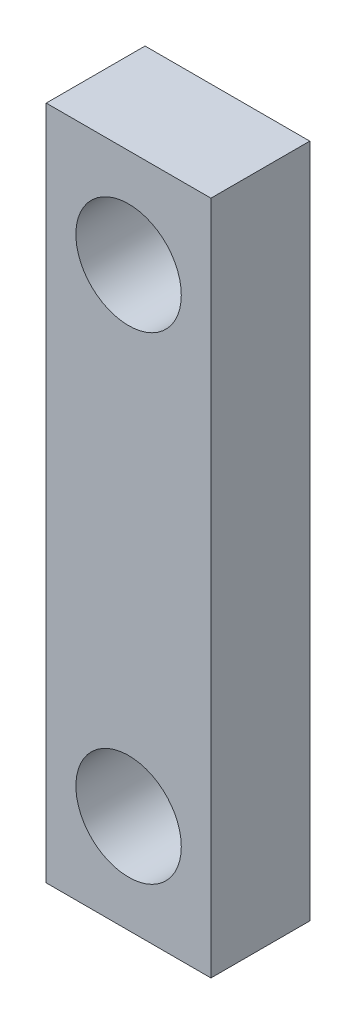
ISO-10303-21;
HEADER;
FILE_DESCRIPTION(('STEP AP214'),'2;1');
FILE_NAME('part.step','',(''),(''),'','','');
FILE_SCHEMA(('AUTOMOTIVE_DESIGN { 1 0 10303 214 1 1 1 1 }'));
ENDSEC;
DATA;
#1=APPLICATION_CONTEXT('core data for automotive mechanical design processes');
#2=APPLICATION_PROTOCOL_DEFINITION('international standard','automotive_design',2000,#1);
#3=PRODUCT_CONTEXT('',#1,'mechanical');
#4=PRODUCT('Part','Part','',(#3));
#5=PRODUCT_RELATED_PRODUCT_CATEGORY('part','',(#4));
#6=PRODUCT_DEFINITION_FORMATION('','',#4);
#7=PRODUCT_DEFINITION_CONTEXT('part definition',#1,'design');
#8=PRODUCT_DEFINITION('design','',#6,#7);
#9=PRODUCT_DEFINITION_SHAPE('','',#8);
#10=(LENGTH_UNIT() NAMED_UNIT(*) SI_UNIT(.MILLI.,.METRE.));
#11=(NAMED_UNIT(*) PLANE_ANGLE_UNIT() SI_UNIT($,.RADIAN.));
#12=(NAMED_UNIT(*) SI_UNIT($,.STERADIAN.) SOLID_ANGLE_UNIT());
#13=UNCERTAINTY_MEASURE_WITH_UNIT(LENGTH_MEASURE(1.E-05),#10,'distance_accuracy_value','');
#14=(GEOMETRIC_REPRESENTATION_CONTEXT(3) GLOBAL_UNCERTAINTY_ASSIGNED_CONTEXT((#13)) GLOBAL_UNIT_ASSIGNED_CONTEXT((#10,
#11,#12)) REPRESENTATION_CONTEXT('',''));
#15=CARTESIAN_POINT('',(0.,0.,0.));
#16=DIRECTION('',(0.,0.,1.));
#17=DIRECTION('',(1.,0.,0.));
#18=AXIS2_PLACEMENT_3D('',#15,#16,#17);
#19=CARTESIAN_POINT('',(0.,0.,3.));
#20=DIRECTION('',(0.,0.,-1.));
#21=DIRECTION('',(-1.,0.,0.));
#22=AXIS2_PLACEMENT_3D('',#19,#20,#21);
#23=PLANE('',#22);
#24=DIRECTION('',(0.,1.,0.));
#25=VECTOR('',#24,1.);
#26=CARTESIAN_POINT('',(2.5,-10.25,3.));
#27=LINE('',#26,#25);
#28=CARTESIAN_POINT('',(2.5,-10.25,3.));
#29=VERTEX_POINT('',#28);
#30=CARTESIAN_POINT('',(2.5,10.25,3.));
#31=VERTEX_POINT('',#30);
#32=EDGE_CURVE('E85',#29,#31,#27,.T.);
#33=ORIENTED_EDGE('',*,*,#32,.T.);
#34=DIRECTION('',(-1.,0.,0.));
#35=VECTOR('',#34,1.);
#36=CARTESIAN_POINT('',(-2.5,10.25,3.));
#37=LINE('',#36,#35);
#38=CARTESIAN_POINT('',(-2.5,10.25,3.));
#39=VERTEX_POINT('',#38);
#40=EDGE_CURVE('E80',#31,#39,#37,.T.);
#41=ORIENTED_EDGE('',*,*,#40,.T.);
#42=DIRECTION('',(0.,-1.,0.));
#43=VECTOR('',#42,1.);
#44=CARTESIAN_POINT('',(-2.5,-10.25,3.));
#45=LINE('',#44,#43);
#46=CARTESIAN_POINT('',(-2.5,-10.25,3.));
#47=VERTEX_POINT('',#46);
#48=EDGE_CURVE('E83',#39,#47,#45,.T.);
#49=ORIENTED_EDGE('',*,*,#48,.T.);
#50=DIRECTION('',(1.,0.,0.));
#51=VECTOR('',#50,1.);
#52=CARTESIAN_POINT('',(-2.5,-10.25,3.));
#53=LINE('',#52,#51);
#54=EDGE_CURVE('E50',#47,#29,#53,.T.);
#55=ORIENTED_EDGE('',*,*,#54,.T.);
#56=EDGE_LOOP('',(#33,#41,#49,#55));
#57=FACE_BOUND('',#56,.T.);
#58=CARTESIAN_POINT('',(0.,-7.25,3.));
#59=DIRECTION('',(0.,0.,1.));
#60=DIRECTION('',(1.,0.,0.));
#61=AXIS2_PLACEMENT_3D('',#58,#59,#60);
#62=CIRCLE('',#61,1.6);
#63=CARTESIAN_POINT('',(1.6,-7.25,3.));
#64=VERTEX_POINT('',#63);
#65=EDGE_CURVE('E100',#64,#64,#62,.T.);
#66=ORIENTED_EDGE('',*,*,#65,.F.);
#67=EDGE_LOOP('',(#66));
#68=FACE_BOUND('',#67,.T.);
#69=CARTESIAN_POINT('',(0.,7.25,3.));
#70=DIRECTION('',(0.,0.,1.));
#71=DIRECTION('',(1.,0.,0.));
#72=AXIS2_PLACEMENT_3D('',#69,#70,#71);
#73=CIRCLE('',#72,1.6);
#74=CARTESIAN_POINT('',(1.6,7.25,3.));
#75=VERTEX_POINT('',#74);
#76=EDGE_CURVE('E115',#75,#75,#73,.T.);
#77=ORIENTED_EDGE('',*,*,#76,.F.);
#78=EDGE_LOOP('',(#77));
#79=FACE_BOUND('',#78,.T.);
#80=ADVANCED_FACE('F33',(#57,#68,#79),#23,.F.);
#81=CARTESIAN_POINT('',(0.,0.,0.));
#82=DIRECTION('',(0.,0.,-1.));
#83=DIRECTION('',(-1.,0.,0.));
#84=AXIS2_PLACEMENT_3D('',#81,#82,#83);
#85=PLANE('',#84);
#86=CARTESIAN_POINT('',(0.,-7.25,0.));
#87=DIRECTION('',(0.,0.,1.));
#88=DIRECTION('',(1.,0.,0.));
#89=AXIS2_PLACEMENT_3D('',#86,#87,#88);
#90=CIRCLE('',#89,1.6);
#91=CARTESIAN_POINT('',(1.6,-7.25,0.));
#92=VERTEX_POINT('',#91);
#93=EDGE_CURVE('E112',#92,#92,#90,.T.);
#94=ORIENTED_EDGE('',*,*,#93,.T.);
#95=EDGE_LOOP('',(#94));
#96=FACE_BOUND('',#95,.T.);
#97=DIRECTION('',(0.,1.,0.));
#98=VECTOR('',#97,1.);
#99=CARTESIAN_POINT('',(2.5,-10.25,0.));
#100=LINE('',#99,#98);
#101=CARTESIAN_POINT('',(2.5,-10.25,0.));
#102=VERTEX_POINT('',#101);
#103=CARTESIAN_POINT('',(2.5,10.25,0.));
#104=VERTEX_POINT('',#103);
#105=EDGE_CURVE('E97',#102,#104,#100,.T.);
#106=ORIENTED_EDGE('',*,*,#105,.F.);
#107=DIRECTION('',(1.,0.,0.));
#108=VECTOR('',#107,1.);
#109=CARTESIAN_POINT('',(-2.5,-10.25,0.));
#110=LINE('',#109,#108);
#111=CARTESIAN_POINT('',(-2.5,-10.25,0.));
#112=VERTEX_POINT('',#111);
#113=EDGE_CURVE('E73',#112,#102,#110,.T.);
#114=ORIENTED_EDGE('',*,*,#113,.F.);
#115=DIRECTION('',(0.,-1.,0.));
#116=VECTOR('',#115,1.);
#117=CARTESIAN_POINT('',(-2.5,-10.25,0.));
#118=LINE('',#117,#116);
#119=CARTESIAN_POINT('',(-2.5,10.25,0.));
#120=VERTEX_POINT('',#119);
#121=EDGE_CURVE('E67',#120,#112,#118,.T.);
#122=ORIENTED_EDGE('',*,*,#121,.F.);
#123=DIRECTION('',(-1.,0.,0.));
#124=VECTOR('',#123,1.);
#125=CARTESIAN_POINT('',(-2.5,10.25,0.));
#126=LINE('',#125,#124);
#127=EDGE_CURVE('E89',#104,#120,#126,.T.);
#128=ORIENTED_EDGE('',*,*,#127,.F.);
#129=EDGE_LOOP('',(#106,#114,#122,#128));
#130=FACE_BOUND('',#129,.T.);
#131=CARTESIAN_POINT('',(0.,7.25,0.));
#132=DIRECTION('',(0.,0.,1.));
#133=DIRECTION('',(1.,0.,0.));
#134=AXIS2_PLACEMENT_3D('',#131,#132,#133);
#135=CIRCLE('',#134,1.6);
#136=CARTESIAN_POINT('',(1.6,7.25,0.));
#137=VERTEX_POINT('',#136);
#138=EDGE_CURVE('E118',#137,#137,#135,.T.);
#139=ORIENTED_EDGE('',*,*,#138,.T.);
#140=EDGE_LOOP('',(#139));
#141=FACE_BOUND('',#140,.T.);
#142=ADVANCED_FACE('F108',(#96,#130,#141),#85,.T.);
#143=CARTESIAN_POINT('',(2.5,-10.25,3.));
#144=DIRECTION('',(-1.,0.,0.));
#145=DIRECTION('',(0.,0.,1.));
#146=AXIS2_PLACEMENT_3D('',#143,#144,#145);
#147=PLANE('',#146);
#148=ORIENTED_EDGE('',*,*,#105,.T.);
#149=DIRECTION('',(0.,0.,-1.));
#150=VECTOR('',#149,1.);
#151=CARTESIAN_POINT('',(2.5,10.25,3.));
#152=LINE('',#151,#150);
#153=EDGE_CURVE('E11',#31,#104,#152,.T.);
#154=ORIENTED_EDGE('',*,*,#153,.F.);
#155=ORIENTED_EDGE('',*,*,#32,.F.);
#156=DIRECTION('',(0.,0.,-1.));
#157=VECTOR('',#156,1.);
#158=CARTESIAN_POINT('',(2.5,-10.25,3.));
#159=LINE('',#158,#157);
#160=EDGE_CURVE('E93',#29,#102,#159,.T.);
#161=ORIENTED_EDGE('',*,*,#160,.T.);
#162=EDGE_LOOP('',(#148,#154,#155,#161));
#163=FACE_BOUND('',#162,.T.);
#164=ADVANCED_FACE('F35',(#163),#147,.F.);
#165=CARTESIAN_POINT('',(-2.5,10.25,3.));
#166=DIRECTION('',(0.,-1.,0.));
#167=DIRECTION('',(0.,0.,-1.));
#168=AXIS2_PLACEMENT_3D('',#165,#166,#167);
#169=PLANE('',#168);
#170=ORIENTED_EDGE('',*,*,#127,.T.);
#171=DIRECTION('',(0.,0.,-1.));
#172=VECTOR('',#171,1.);
#173=CARTESIAN_POINT('',(-2.5,10.25,3.));
#174=LINE('',#173,#172);
#175=EDGE_CURVE('E42',#39,#120,#174,.T.);
#176=ORIENTED_EDGE('',*,*,#175,.F.);
#177=ORIENTED_EDGE('',*,*,#40,.F.);
#178=ORIENTED_EDGE('',*,*,#153,.T.);
#179=EDGE_LOOP('',(#170,#176,#177,#178));
#180=FACE_BOUND('',#179,.T.);
#181=ADVANCED_FACE('F88',(#180),#169,.F.);
#182=CARTESIAN_POINT('',(-2.5,-10.25,3.));
#183=DIRECTION('',(1.,0.,0.));
#184=DIRECTION('',(0.,1.,0.));
#185=AXIS2_PLACEMENT_3D('',#182,#183,#184);
#186=PLANE('',#185);
#187=ORIENTED_EDGE('',*,*,#121,.T.);
#188=DIRECTION('',(0.,0.,-1.));
#189=VECTOR('',#188,1.);
#190=CARTESIAN_POINT('',(-2.5,-10.25,3.));
#191=LINE('',#190,#189);
#192=EDGE_CURVE('E90',#47,#112,#191,.T.);
#193=ORIENTED_EDGE('',*,*,#192,.F.);
#194=ORIENTED_EDGE('',*,*,#48,.F.);
#195=ORIENTED_EDGE('',*,*,#175,.T.);
#196=EDGE_LOOP('',(#187,#193,#194,#195));
#197=FACE_BOUND('',#196,.T.);
#198=ADVANCED_FACE('F91',(#197),#186,.F.);
#199=CARTESIAN_POINT('',(-2.5,-10.25,3.));
#200=DIRECTION('',(0.,1.,0.));
#201=DIRECTION('',(0.,0.,1.));
#202=AXIS2_PLACEMENT_3D('',#199,#200,#201);
#203=PLANE('',#202);
#204=ORIENTED_EDGE('',*,*,#113,.T.);
#205=ORIENTED_EDGE('',*,*,#160,.F.);
#206=ORIENTED_EDGE('',*,*,#54,.F.);
#207=ORIENTED_EDGE('',*,*,#192,.T.);
#208=EDGE_LOOP('',(#204,#205,#206,#207));
#209=FACE_BOUND('',#208,.T.);
#210=ADVANCED_FACE('F105',(#209),#203,.F.);
#211=CARTESIAN_POINT('',(0.,-7.25,3.));
#212=DIRECTION('',(0.,0.,-1.));
#213=DIRECTION('',(-1.,0.,0.));
#214=AXIS2_PLACEMENT_3D('',#211,#212,#213);
#215=CYLINDRICAL_SURFACE('',#214,1.6);
#216=ORIENTED_EDGE('',*,*,#65,.T.);
#217=EDGE_LOOP('',(#216));
#218=FACE_BOUND('',#217,.T.);
#219=ORIENTED_EDGE('',*,*,#93,.F.);
#220=EDGE_LOOP('',(#219));
#221=FACE_BOUND('',#220,.T.);
#222=ADVANCED_FACE('F135',(#218,#221),#215,.F.);
#223=CARTESIAN_POINT('',(0.,7.25,3.));
#224=DIRECTION('',(0.,0.,-1.));
#225=DIRECTION('',(-1.,0.,0.));
#226=AXIS2_PLACEMENT_3D('',#223,#224,#225);
#227=CYLINDRICAL_SURFACE('',#226,1.6);
#228=ORIENTED_EDGE('',*,*,#76,.T.);
#229=EDGE_LOOP('',(#228));
#230=FACE_BOUND('',#229,.T.);
#231=ORIENTED_EDGE('',*,*,#138,.F.);
#232=EDGE_LOOP('',(#231));
#233=FACE_BOUND('',#232,.T.);
#234=ADVANCED_FACE('F124',(#230,#233),#227,.F.);
#235=CLOSED_SHELL('',(#80,#142,#164,#181,#198,#210,#222,#234));
#236=MANIFOLD_SOLID_BREP('B2',#235);
#237=ADVANCED_BREP_SHAPE_REPRESENTATION('',(#18,#236),#14);
#238=SHAPE_DEFINITION_REPRESENTATION(#9,#237);
ENDSEC;
END-ISO-10303-21;
